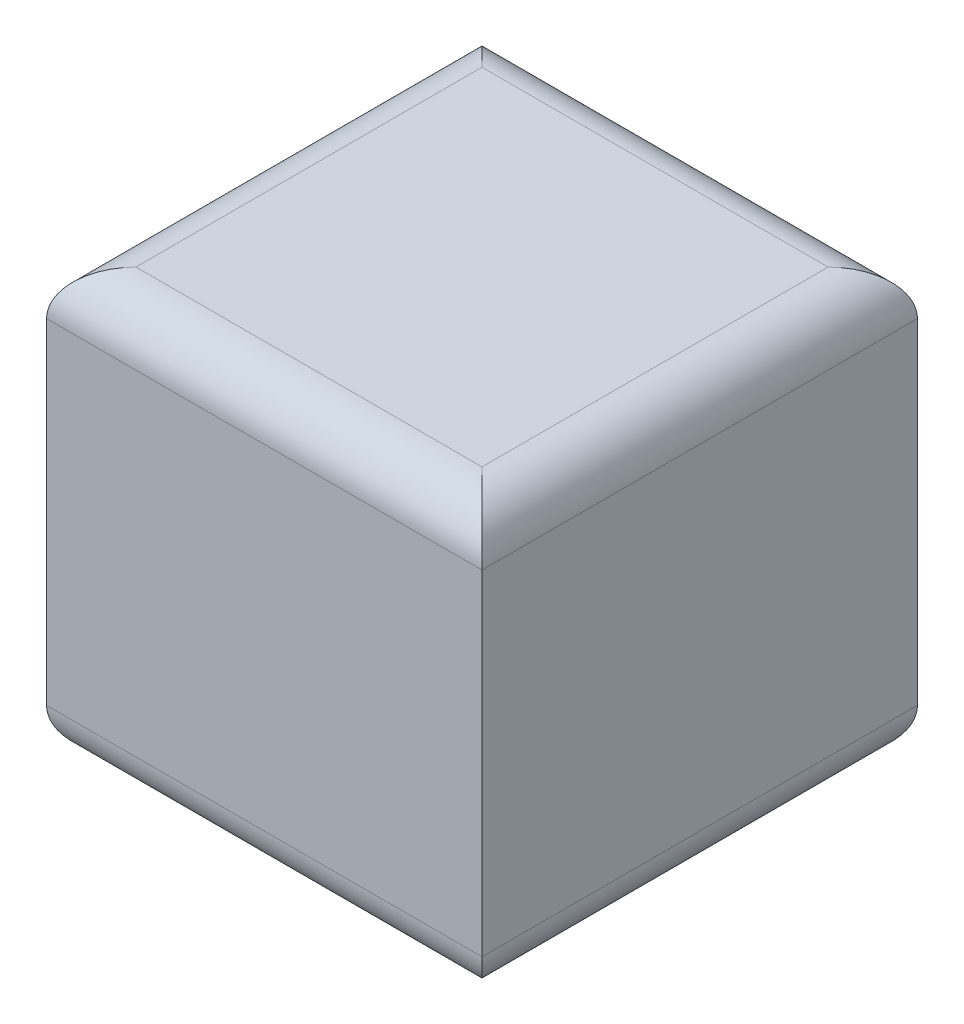
ISO-10303-21;
HEADER;
FILE_DESCRIPTION(('STEP AP214'),'2;1');
FILE_NAME('part.step','',(''),(''),'','','');
FILE_SCHEMA(('AUTOMOTIVE_DESIGN { 1 0 10303 214 1 1 1 1 }'));
ENDSEC;
DATA;
#1=APPLICATION_CONTEXT('core data for automotive mechanical design processes');
#2=APPLICATION_PROTOCOL_DEFINITION('international standard','automotive_design',2000,#1);
#3=PRODUCT_CONTEXT('',#1,'mechanical');
#4=PRODUCT('Part','Part','',(#3));
#5=PRODUCT_RELATED_PRODUCT_CATEGORY('part','',(#4));
#6=PRODUCT_DEFINITION_FORMATION('','',#4);
#7=PRODUCT_DEFINITION_CONTEXT('part definition',#1,'design');
#8=PRODUCT_DEFINITION('design','',#6,#7);
#9=PRODUCT_DEFINITION_SHAPE('','',#8);
#10=(LENGTH_UNIT() NAMED_UNIT(*) SI_UNIT(.MILLI.,.METRE.));
#11=(NAMED_UNIT(*) PLANE_ANGLE_UNIT() SI_UNIT($,.RADIAN.));
#12=(NAMED_UNIT(*) SI_UNIT($,.STERADIAN.) SOLID_ANGLE_UNIT());
#13=UNCERTAINTY_MEASURE_WITH_UNIT(LENGTH_MEASURE(1.E-05),#10,'distance_accuracy_value','');
#14=(GEOMETRIC_REPRESENTATION_CONTEXT(3) GLOBAL_UNCERTAINTY_ASSIGNED_CONTEXT((#13)) GLOBAL_UNIT_ASSIGNED_CONTEXT((#10,
#11,#12)) REPRESENTATION_CONTEXT('',''));
#15=CARTESIAN_POINT('',(0.,0.,0.));
#16=DIRECTION('',(0.,0.,1.));
#17=DIRECTION('',(1.,0.,0.));
#18=AXIS2_PLACEMENT_3D('',#15,#16,#17);
#19=CARTESIAN_POINT('',(4.875,4.75,4.875));
#20=DIRECTION('',(-1.,0.,0.));
#21=DIRECTION('',(0.,0.,1.));
#22=AXIS2_PLACEMENT_3D('',#19,#20,#21);
#23=PLANE('',#22);
#24=DIRECTION('',(0.,-1.,0.));
#25=VECTOR('',#24,1.);
#26=CARTESIAN_POINT('',(4.875,4.75,4.875));
#27=LINE('',#26,#25);
#28=CARTESIAN_POINT('',(4.875,3.75,4.875));
#29=VERTEX_POINT('',#28);
#30=CARTESIAN_POINT('',(4.875,-3.75,4.875));
#31=VERTEX_POINT('',#30);
#32=EDGE_CURVE('E148',#29,#31,#27,.T.);
#33=ORIENTED_EDGE('',*,*,#32,.T.);
#34=DIRECTION('',(0.,0.,-1.));
#35=VECTOR('',#34,1.);
#36=CARTESIAN_POINT('',(4.875,-3.75,-4.875));
#37=LINE('',#36,#35);
#38=CARTESIAN_POINT('',(4.875,-3.75,-4.875));
#39=VERTEX_POINT('',#38);
#40=EDGE_CURVE('E157',#31,#39,#37,.T.);
#41=ORIENTED_EDGE('',*,*,#40,.T.);
#42=DIRECTION('',(0.,-1.,0.));
#43=VECTOR('',#42,1.);
#44=CARTESIAN_POINT('',(4.875,4.75,-4.875));
#45=LINE('',#44,#43);
#46=CARTESIAN_POINT('',(4.875,3.75,-4.875));
#47=VERTEX_POINT('',#46);
#48=EDGE_CURVE('E126',#47,#39,#45,.T.);
#49=ORIENTED_EDGE('',*,*,#48,.F.);
#50=DIRECTION('',(0.,0.,-1.));
#51=VECTOR('',#50,1.);
#52=CARTESIAN_POINT('',(4.875,3.75,4.875));
#53=LINE('',#52,#51);
#54=EDGE_CURVE('E159',#47,#29,#53,.F.);
#55=ORIENTED_EDGE('',*,*,#54,.T.);
#56=EDGE_LOOP('',(#33,#41,#49,#55));
#57=FACE_BOUND('',#56,.T.);
#58=ADVANCED_FACE('F39',(#57),#23,.F.);
#59=CARTESIAN_POINT('',(-4.875,4.75,-4.875));
#60=DIRECTION('',(0.,0.,1.));
#61=DIRECTION('',(1.,0.,0.));
#62=AXIS2_PLACEMENT_3D('',#59,#60,#61);
#63=PLANE('',#62);
#64=ORIENTED_EDGE('',*,*,#48,.T.);
#65=DIRECTION('',(-1.,0.,0.));
#66=VECTOR('',#65,1.);
#67=CARTESIAN_POINT('',(-4.875,-3.75,-4.875));
#68=LINE('',#67,#66);
#69=CARTESIAN_POINT('',(-4.875,-3.75,-4.875));
#70=VERTEX_POINT('',#69);
#71=EDGE_CURVE('E125',#39,#70,#68,.T.);
#72=ORIENTED_EDGE('',*,*,#71,.T.);
#73=DIRECTION('',(0.,-1.,0.));
#74=VECTOR('',#73,1.);
#75=CARTESIAN_POINT('',(-4.875,4.75,-4.875));
#76=LINE('',#75,#74);
#77=CARTESIAN_POINT('',(-4.875,3.75,-4.875));
#78=VERTEX_POINT('',#77);
#79=EDGE_CURVE('E108',#78,#70,#76,.T.);
#80=ORIENTED_EDGE('',*,*,#79,.F.);
#81=DIRECTION('',(-1.,0.,0.));
#82=VECTOR('',#81,1.);
#83=CARTESIAN_POINT('',(-4.875,3.75,-4.875));
#84=LINE('',#83,#82);
#85=EDGE_CURVE('E122',#78,#47,#84,.F.);
#86=ORIENTED_EDGE('',*,*,#85,.T.);
#87=EDGE_LOOP('',(#64,#72,#80,#86));
#88=FACE_BOUND('',#87,.T.);
#89=ADVANCED_FACE('F121',(#88),#63,.F.);
#90=CARTESIAN_POINT('',(-4.875,4.75,4.875));
#91=DIRECTION('',(1.,0.,0.));
#92=DIRECTION('',(0.,0.,-1.));
#93=AXIS2_PLACEMENT_3D('',#90,#91,#92);
#94=PLANE('',#93);
#95=ORIENTED_EDGE('',*,*,#79,.T.);
#96=DIRECTION('',(0.,0.,1.));
#97=VECTOR('',#96,1.);
#98=CARTESIAN_POINT('',(-4.875,-3.75,4.875));
#99=LINE('',#98,#97);
#100=CARTESIAN_POINT('',(-4.875,-3.75,4.875));
#101=VERTEX_POINT('',#100);
#102=EDGE_CURVE('E114',#70,#101,#99,.T.);
#103=ORIENTED_EDGE('',*,*,#102,.T.);
#104=DIRECTION('',(0.,-1.,0.));
#105=VECTOR('',#104,1.);
#106=CARTESIAN_POINT('',(-4.875,4.75,4.875));
#107=LINE('',#106,#105);
#108=CARTESIAN_POINT('',(-4.875,3.75,4.875));
#109=VERTEX_POINT('',#108);
#110=EDGE_CURVE('E110',#109,#101,#107,.T.);
#111=ORIENTED_EDGE('',*,*,#110,.F.);
#112=DIRECTION('',(0.,0.,1.));
#113=VECTOR('',#112,1.);
#114=CARTESIAN_POINT('',(-4.875,3.75,4.875));
#115=LINE('',#114,#113);
#116=EDGE_CURVE('E105',#109,#78,#115,.F.);
#117=ORIENTED_EDGE('',*,*,#116,.T.);
#118=EDGE_LOOP('',(#95,#103,#111,#117));
#119=FACE_BOUND('',#118,.T.);
#120=ADVANCED_FACE('F107',(#119),#94,.F.);
#121=CARTESIAN_POINT('',(-4.875,4.75,4.875));
#122=DIRECTION('',(0.,0.,-1.));
#123=DIRECTION('',(-1.,0.,0.));
#124=AXIS2_PLACEMENT_3D('',#121,#122,#123);
#125=PLANE('',#124);
#126=ORIENTED_EDGE('',*,*,#110,.T.);
#127=DIRECTION('',(1.,0.,0.));
#128=VECTOR('',#127,1.);
#129=CARTESIAN_POINT('',(4.875,-3.75,4.875));
#130=LINE('',#129,#128);
#131=EDGE_CURVE('E161',#101,#31,#130,.T.);
#132=ORIENTED_EDGE('',*,*,#131,.T.);
#133=ORIENTED_EDGE('',*,*,#32,.F.);
#134=DIRECTION('',(1.,0.,0.));
#135=VECTOR('',#134,1.);
#136=CARTESIAN_POINT('',(-4.875,3.75,4.875));
#137=LINE('',#136,#135);
#138=EDGE_CURVE('E163',#29,#109,#137,.F.);
#139=ORIENTED_EDGE('',*,*,#138,.T.);
#140=EDGE_LOOP('',(#126,#132,#133,#139));
#141=FACE_BOUND('',#140,.T.);
#142=ADVANCED_FACE('F201',(#141),#125,.F.);
#143=CARTESIAN_POINT('',(0.,4.75,0.));
#144=DIRECTION('',(0.,-1.,0.));
#145=DIRECTION('',(0.,0.,-1.));
#146=AXIS2_PLACEMENT_3D('',#143,#144,#145);
#147=PLANE('',#146);
#148=DIRECTION('',(0.,0.,1.));
#149=VECTOR('',#148,1.);
#150=CARTESIAN_POINT('',(-3.875,4.75,0.));
#151=LINE('',#150,#149);
#152=CARTESIAN_POINT('',(-3.875,4.75,-3.875));
#153=VERTEX_POINT('',#152);
#154=CARTESIAN_POINT('',(-3.875,4.75,3.875));
#155=VERTEX_POINT('',#154);
#156=EDGE_CURVE('E48',#153,#155,#151,.T.);
#157=ORIENTED_EDGE('',*,*,#156,.T.);
#158=DIRECTION('',(1.,0.,0.));
#159=VECTOR('',#158,1.);
#160=CARTESIAN_POINT('',(0.,4.75,3.875));
#161=LINE('',#160,#159);
#162=CARTESIAN_POINT('',(3.875,4.75,3.875));
#163=VERTEX_POINT('',#162);
#164=EDGE_CURVE('E11',#155,#163,#161,.T.);
#165=ORIENTED_EDGE('',*,*,#164,.T.);
#166=DIRECTION('',(0.,0.,-1.));
#167=VECTOR('',#166,1.);
#168=CARTESIAN_POINT('',(3.875,4.75,0.));
#169=LINE('',#168,#167);
#170=CARTESIAN_POINT('',(3.875,4.75,-3.875));
#171=VERTEX_POINT('',#170);
#172=EDGE_CURVE('E155',#163,#171,#169,.T.);
#173=ORIENTED_EDGE('',*,*,#172,.T.);
#174=DIRECTION('',(-1.,0.,0.));
#175=VECTOR('',#174,1.);
#176=CARTESIAN_POINT('',(0.,4.75,-3.875));
#177=LINE('',#176,#175);
#178=EDGE_CURVE('E59',#171,#153,#177,.T.);
#179=ORIENTED_EDGE('',*,*,#178,.T.);
#180=EDGE_LOOP('',(#157,#165,#173,#179));
#181=FACE_BOUND('',#180,.T.);
#182=ADVANCED_FACE('F207',(#181),#147,.F.);
#183=CARTESIAN_POINT('',(0.,-4.75,0.));
#184=DIRECTION('',(0.,-1.,0.));
#185=DIRECTION('',(0.,0.,-1.));
#186=AXIS2_PLACEMENT_3D('',#183,#184,#185);
#187=PLANE('',#186);
#188=DIRECTION('',(0.,0.,1.));
#189=VECTOR('',#188,1.);
#190=CARTESIAN_POINT('',(-3.875,-4.75,-4.875));
#191=LINE('',#190,#189);
#192=CARTESIAN_POINT('',(-3.875,-4.75,3.875));
#193=VERTEX_POINT('',#192);
#194=CARTESIAN_POINT('',(-3.875,-4.75,-3.875));
#195=VERTEX_POINT('',#194);
#196=EDGE_CURVE('E168',#193,#195,#191,.F.);
#197=ORIENTED_EDGE('',*,*,#196,.T.);
#198=DIRECTION('',(-1.,0.,0.));
#199=VECTOR('',#198,1.);
#200=CARTESIAN_POINT('',(4.875,-4.75,-3.875));
#201=LINE('',#200,#199);
#202=CARTESIAN_POINT('',(3.875,-4.75,-3.875));
#203=VERTEX_POINT('',#202);
#204=EDGE_CURVE('E115',#195,#203,#201,.F.);
#205=ORIENTED_EDGE('',*,*,#204,.T.);
#206=DIRECTION('',(0.,0.,-1.));
#207=VECTOR('',#206,1.);
#208=CARTESIAN_POINT('',(3.875,-4.75,4.875));
#209=LINE('',#208,#207);
#210=CARTESIAN_POINT('',(3.875,-4.75,3.875));
#211=VERTEX_POINT('',#210);
#212=EDGE_CURVE('E172',#203,#211,#209,.F.);
#213=ORIENTED_EDGE('',*,*,#212,.T.);
#214=DIRECTION('',(1.,0.,0.));
#215=VECTOR('',#214,1.);
#216=CARTESIAN_POINT('',(-4.875,-4.75,3.875));
#217=LINE('',#216,#215);
#218=EDGE_CURVE('E170',#211,#193,#217,.F.);
#219=ORIENTED_EDGE('',*,*,#218,.T.);
#220=EDGE_LOOP('',(#197,#205,#213,#219));
#221=FACE_BOUND('',#220,.T.);
#222=ADVANCED_FACE('F209',(#221),#187,.T.);
#223=CARTESIAN_POINT('',(-4.875,-3.75,3.875));
#224=DIRECTION('',(-1.,0.,0.));
#225=DIRECTION('',(0.,0.,1.));
#226=AXIS2_PLACEMENT_3D('',#223,#224,#225);
#227=CYLINDRICAL_SURFACE('',#226,1.);
#228=CARTESIAN_POINT('',(-3.875,-3.75,3.875));
#229=DIRECTION('',(-0.707106781186547,0.,-0.707106781186547));
#230=DIRECTION('',(-0.707106781186547,0.,0.707106781186547));
#231=AXIS2_PLACEMENT_3D('',#228,#229,#230);
#232=ELLIPSE('',#231,1.41421356237309,1.);
#233=EDGE_CURVE('E149',#193,#101,#232,.T.);
#234=ORIENTED_EDGE('',*,*,#233,.F.);
#235=ORIENTED_EDGE('',*,*,#218,.F.);
#236=CARTESIAN_POINT('',(3.875,-3.75,3.875));
#237=DIRECTION('',(-0.707106781186547,0.,0.707106781186547));
#238=DIRECTION('',(0.707106781186547,0.,0.707106781186547));
#239=AXIS2_PLACEMENT_3D('',#236,#237,#238);
#240=ELLIPSE('',#239,1.41421356237309,1.);
#241=EDGE_CURVE('E145',#31,#211,#240,.F.);
#242=ORIENTED_EDGE('',*,*,#241,.F.);
#243=ORIENTED_EDGE('',*,*,#131,.F.);
#244=EDGE_LOOP('',(#234,#235,#242,#243));
#245=FACE_BOUND('',#244,.T.);
#246=ADVANCED_FACE('F188',(#245),#227,.T.);
#247=CARTESIAN_POINT('',(3.875,-3.75,4.875));
#248=DIRECTION('',(0.,0.,1.));
#249=DIRECTION('',(1.,0.,0.));
#250=AXIS2_PLACEMENT_3D('',#247,#248,#249);
#251=CYLINDRICAL_SURFACE('',#250,1.);
#252=ORIENTED_EDGE('',*,*,#241,.T.);
#253=ORIENTED_EDGE('',*,*,#212,.F.);
#254=CARTESIAN_POINT('',(3.875,-3.75,-3.875));
#255=DIRECTION('',(0.707106781186547,0.,0.707106781186547));
#256=DIRECTION('',(-0.707106781186547,0.,0.707106781186547));
#257=AXIS2_PLACEMENT_3D('',#254,#255,#256);
#258=ELLIPSE('',#257,1.41421356237309,1.);
#259=EDGE_CURVE('E136',#39,#203,#258,.F.);
#260=ORIENTED_EDGE('',*,*,#259,.F.);
#261=ORIENTED_EDGE('',*,*,#40,.F.);
#262=EDGE_LOOP('',(#252,#253,#260,#261));
#263=FACE_BOUND('',#262,.T.);
#264=ADVANCED_FACE('F192',(#263),#251,.T.);
#265=CARTESIAN_POINT('',(-3.875,-3.75,4.875));
#266=DIRECTION('',(0.,0.,-1.));
#267=DIRECTION('',(-1.,0.,0.));
#268=AXIS2_PLACEMENT_3D('',#265,#266,#267);
#269=CYLINDRICAL_SURFACE('',#268,1.);
#270=ORIENTED_EDGE('',*,*,#233,.T.);
#271=ORIENTED_EDGE('',*,*,#102,.F.);
#272=CARTESIAN_POINT('',(-3.875,-3.75,-3.875));
#273=DIRECTION('',(0.707106781186547,0.,-0.707106781186547));
#274=DIRECTION('',(-0.707106781186547,0.,-0.707106781186547));
#275=AXIS2_PLACEMENT_3D('',#272,#273,#274);
#276=ELLIPSE('',#275,1.41421356237309,1.);
#277=EDGE_CURVE('E135',#195,#70,#276,.T.);
#278=ORIENTED_EDGE('',*,*,#277,.F.);
#279=ORIENTED_EDGE('',*,*,#196,.F.);
#280=EDGE_LOOP('',(#270,#271,#278,#279));
#281=FACE_BOUND('',#280,.T.);
#282=ADVANCED_FACE('F200',(#281),#269,.T.);
#283=CARTESIAN_POINT('',(-4.875,-3.75,-3.875));
#284=DIRECTION('',(1.,0.,0.));
#285=DIRECTION('',(0.,0.,-1.));
#286=AXIS2_PLACEMENT_3D('',#283,#284,#285);
#287=CYLINDRICAL_SURFACE('',#286,1.);
#288=ORIENTED_EDGE('',*,*,#259,.T.);
#289=ORIENTED_EDGE('',*,*,#204,.F.);
#290=ORIENTED_EDGE('',*,*,#277,.T.);
#291=ORIENTED_EDGE('',*,*,#71,.F.);
#292=EDGE_LOOP('',(#288,#289,#290,#291));
#293=FACE_BOUND('',#292,.T.);
#294=ADVANCED_FACE('F195',(#293),#287,.T.);
#295=CARTESIAN_POINT('',(0.,3.75,-3.875));
#296=DIRECTION('',(-1.,0.,0.));
#297=DIRECTION('',(0.,0.,1.));
#298=AXIS2_PLACEMENT_3D('',#295,#296,#297);
#299=CYLINDRICAL_SURFACE('',#298,1.);
#300=CARTESIAN_POINT('',(3.875,3.75,-3.875));
#301=DIRECTION('',(-0.707106781186547,0.,-0.707106781186547));
#302=DIRECTION('',(0.707106781186547,0.,-0.707106781186547));
#303=AXIS2_PLACEMENT_3D('',#300,#301,#302);
#304=ELLIPSE('',#303,1.41421356237309,1.);
#305=EDGE_CURVE('E131',#47,#171,#304,.F.);
#306=ORIENTED_EDGE('',*,*,#305,.F.);
#307=ORIENTED_EDGE('',*,*,#85,.F.);
#308=CARTESIAN_POINT('',(-3.875,3.75,-3.875));
#309=DIRECTION('',(-0.707106781186547,0.,0.707106781186547));
#310=DIRECTION('',(-0.707106781186547,0.,-0.707106781186547));
#311=AXIS2_PLACEMENT_3D('',#308,#309,#310);
#312=ELLIPSE('',#311,1.41421356237309,1.);
#313=EDGE_CURVE('E43',#153,#78,#312,.T.);
#314=ORIENTED_EDGE('',*,*,#313,.F.);
#315=ORIENTED_EDGE('',*,*,#178,.F.);
#316=EDGE_LOOP('',(#306,#307,#314,#315));
#317=FACE_BOUND('',#316,.T.);
#318=ADVANCED_FACE('F41',(#317),#299,.T.);
#319=CARTESIAN_POINT('',(-3.875,3.75,0.));
#320=DIRECTION('',(0.,0.,1.));
#321=DIRECTION('',(1.,0.,0.));
#322=AXIS2_PLACEMENT_3D('',#319,#320,#321);
#323=CYLINDRICAL_SURFACE('',#322,1.);
#324=ORIENTED_EDGE('',*,*,#313,.T.);
#325=ORIENTED_EDGE('',*,*,#116,.F.);
#326=CARTESIAN_POINT('',(-3.875,3.75,3.875));
#327=DIRECTION('',(0.707106781186547,0.,0.707106781186547));
#328=DIRECTION('',(-0.707106781186547,0.,0.707106781186547));
#329=AXIS2_PLACEMENT_3D('',#326,#327,#328);
#330=ELLIPSE('',#329,1.41421356237309,1.);
#331=EDGE_CURVE('E138',#155,#109,#330,.T.);
#332=ORIENTED_EDGE('',*,*,#331,.F.);
#333=ORIENTED_EDGE('',*,*,#156,.F.);
#334=EDGE_LOOP('',(#324,#325,#332,#333));
#335=FACE_BOUND('',#334,.T.);
#336=ADVANCED_FACE('F134',(#335),#323,.T.);
#337=CARTESIAN_POINT('',(3.875,3.75,0.));
#338=DIRECTION('',(0.,0.,-1.));
#339=DIRECTION('',(-1.,0.,0.));
#340=AXIS2_PLACEMENT_3D('',#337,#338,#339);
#341=CYLINDRICAL_SURFACE('',#340,1.);
#342=ORIENTED_EDGE('',*,*,#305,.T.);
#343=ORIENTED_EDGE('',*,*,#172,.F.);
#344=CARTESIAN_POINT('',(3.875,3.75,3.875));
#345=DIRECTION('',(0.707106781186547,0.,-0.707106781186547));
#346=DIRECTION('',(-0.707106781186547,0.,-0.707106781186547));
#347=AXIS2_PLACEMENT_3D('',#344,#345,#346);
#348=ELLIPSE('',#347,1.41421356237309,1.);
#349=EDGE_CURVE('E141',#29,#163,#348,.F.);
#350=ORIENTED_EDGE('',*,*,#349,.F.);
#351=ORIENTED_EDGE('',*,*,#54,.F.);
#352=EDGE_LOOP('',(#342,#343,#350,#351));
#353=FACE_BOUND('',#352,.T.);
#354=ADVANCED_FACE('F206',(#353),#341,.T.);
#355=CARTESIAN_POINT('',(0.,3.75,3.875));
#356=DIRECTION('',(1.,0.,0.));
#357=DIRECTION('',(0.,0.,-1.));
#358=AXIS2_PLACEMENT_3D('',#355,#356,#357);
#359=CYLINDRICAL_SURFACE('',#358,1.);
#360=ORIENTED_EDGE('',*,*,#331,.T.);
#361=ORIENTED_EDGE('',*,*,#138,.F.);
#362=ORIENTED_EDGE('',*,*,#349,.T.);
#363=ORIENTED_EDGE('',*,*,#164,.F.);
#364=EDGE_LOOP('',(#360,#361,#362,#363));
#365=FACE_BOUND('',#364,.T.);
#366=ADVANCED_FACE('F204',(#365),#359,.T.);
#367=CLOSED_SHELL('',(#58,#89,#120,#142,#182,#222,#246,#264,#282,#294,#318,#336,#354,#366));
#368=MANIFOLD_SOLID_BREP('B2',#367);
#369=ADVANCED_BREP_SHAPE_REPRESENTATION('',(#18,#368),#14);
#370=SHAPE_DEFINITION_REPRESENTATION(#9,#369);
ENDSEC;
END-ISO-10303-21;
